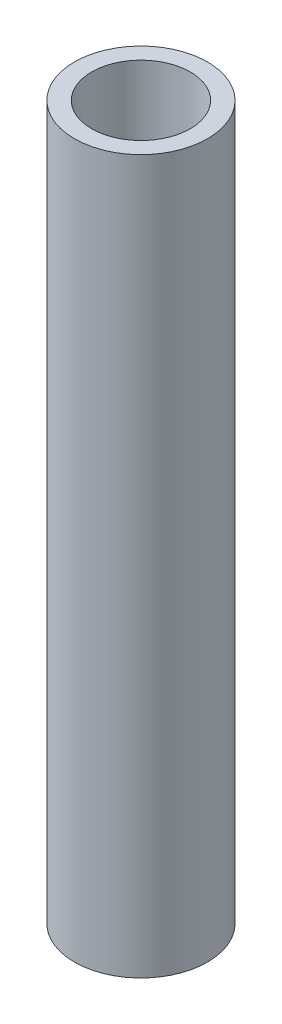
ISO-10303-21;
HEADER;
FILE_DESCRIPTION(('STEP AP214'),'2;1');
FILE_NAME('part.step','',(''),(''),'','','');
FILE_SCHEMA(('AUTOMOTIVE_DESIGN { 1 0 10303 214 1 1 1 1 }'));
ENDSEC;
DATA;
#1=APPLICATION_CONTEXT('core data for automotive mechanical design processes');
#2=APPLICATION_PROTOCOL_DEFINITION('international standard','automotive_design',2000,#1);
#3=PRODUCT_CONTEXT('',#1,'mechanical');
#4=PRODUCT('Part','Part','',(#3));
#5=PRODUCT_RELATED_PRODUCT_CATEGORY('part','',(#4));
#6=PRODUCT_DEFINITION_FORMATION('','',#4);
#7=PRODUCT_DEFINITION_CONTEXT('part definition',#1,'design');
#8=PRODUCT_DEFINITION('design','',#6,#7);
#9=PRODUCT_DEFINITION_SHAPE('','',#8);
#10=(LENGTH_UNIT() NAMED_UNIT(*) SI_UNIT(.MILLI.,.METRE.));
#11=(NAMED_UNIT(*) PLANE_ANGLE_UNIT() SI_UNIT($,.RADIAN.));
#12=(NAMED_UNIT(*) SI_UNIT($,.STERADIAN.) SOLID_ANGLE_UNIT());
#13=UNCERTAINTY_MEASURE_WITH_UNIT(LENGTH_MEASURE(1.E-05),#10,'distance_accuracy_value','');
#14=(GEOMETRIC_REPRESENTATION_CONTEXT(3) GLOBAL_UNCERTAINTY_ASSIGNED_CONTEXT((#13)) GLOBAL_UNIT_ASSIGNED_CONTEXT((#10,
#11,#12)) REPRESENTATION_CONTEXT('',''));
#15=CARTESIAN_POINT('',(0.,0.,0.));
#16=DIRECTION('',(0.,0.,1.));
#17=DIRECTION('',(1.,0.,0.));
#18=AXIS2_PLACEMENT_3D('',#15,#16,#17);
#19=CARTESIAN_POINT('',(0.,114.3,0.));
#20=DIRECTION('',(0.,1.,0.));
#21=DIRECTION('',(0.,0.,1.));
#22=AXIS2_PLACEMENT_3D('',#19,#20,#21);
#23=PLANE('',#22);
#24=CARTESIAN_POINT('',(0.,114.3,0.));
#25=DIRECTION('',(0.,1.,0.));
#26=DIRECTION('',(0.,0.,1.));
#27=AXIS2_PLACEMENT_3D('',#24,#25,#26);
#28=CIRCLE('',#27,10.668);
#29=CARTESIAN_POINT('',(0.,114.3,10.668));
#30=VERTEX_POINT('',#29);
#31=EDGE_CURVE('E10',#30,#30,#28,.T.);
#32=ORIENTED_EDGE('',*,*,#31,.T.);
#33=EDGE_LOOP('',(#32));
#34=FACE_BOUND('',#33,.T.);
#35=CARTESIAN_POINT('',(0.,114.3,0.));
#36=DIRECTION('',(0.,1.,0.));
#37=DIRECTION('',(0.,0.,1.));
#38=AXIS2_PLACEMENT_3D('',#35,#36,#37);
#39=CIRCLE('',#38,7.8994);
#40=CARTESIAN_POINT('',(0.,114.3,7.8994));
#41=VERTEX_POINT('',#40);
#42=EDGE_CURVE('E43',#41,#41,#39,.T.);
#43=ORIENTED_EDGE('',*,*,#42,.F.);
#44=EDGE_LOOP('',(#43));
#45=FACE_BOUND('',#44,.T.);
#46=ADVANCED_FACE('F32',(#34,#45),#23,.T.);
#47=CARTESIAN_POINT('',(0.,0.,0.));
#48=DIRECTION('',(0.,1.,0.));
#49=DIRECTION('',(0.,0.,1.));
#50=AXIS2_PLACEMENT_3D('',#47,#48,#49);
#51=PLANE('',#50);
#52=CARTESIAN_POINT('',(0.,0.,0.));
#53=DIRECTION('',(0.,1.,0.));
#54=DIRECTION('',(0.,0.,1.));
#55=AXIS2_PLACEMENT_3D('',#52,#53,#54);
#56=CIRCLE('',#55,10.668);
#57=CARTESIAN_POINT('',(0.,0.,10.668));
#58=VERTEX_POINT('',#57);
#59=EDGE_CURVE('E36',#58,#58,#56,.T.);
#60=ORIENTED_EDGE('',*,*,#59,.F.);
#61=EDGE_LOOP('',(#60));
#62=FACE_BOUND('',#61,.T.);
#63=CARTESIAN_POINT('',(0.,0.,0.));
#64=DIRECTION('',(0.,1.,0.));
#65=DIRECTION('',(0.,0.,1.));
#66=AXIS2_PLACEMENT_3D('',#63,#64,#65);
#67=CIRCLE('',#66,7.8994);
#68=CARTESIAN_POINT('',(0.,0.,7.8994));
#69=VERTEX_POINT('',#68);
#70=EDGE_CURVE('E45',#69,#69,#67,.T.);
#71=ORIENTED_EDGE('',*,*,#70,.T.);
#72=EDGE_LOOP('',(#71));
#73=FACE_BOUND('',#72,.T.);
#74=ADVANCED_FACE('F55',(#62,#73),#51,.F.);
#75=CARTESIAN_POINT('',(0.,114.3,0.));
#76=DIRECTION('',(0.,-1.,0.));
#77=DIRECTION('',(0.,0.,-1.));
#78=AXIS2_PLACEMENT_3D('',#75,#76,#77);
#79=CYLINDRICAL_SURFACE('',#78,10.668);
#80=ORIENTED_EDGE('',*,*,#31,.F.);
#81=EDGE_LOOP('',(#80));
#82=FACE_BOUND('',#81,.T.);
#83=ORIENTED_EDGE('',*,*,#59,.T.);
#84=EDGE_LOOP('',(#83));
#85=FACE_BOUND('',#84,.T.);
#86=ADVANCED_FACE('F34',(#82,#85),#79,.T.);
#87=CARTESIAN_POINT('',(0.,114.3,0.));
#88=DIRECTION('',(0.,-1.,0.));
#89=DIRECTION('',(0.,0.,-1.));
#90=AXIS2_PLACEMENT_3D('',#87,#88,#89);
#91=CYLINDRICAL_SURFACE('',#90,7.8994);
#92=ORIENTED_EDGE('',*,*,#42,.T.);
#93=EDGE_LOOP('',(#92));
#94=FACE_BOUND('',#93,.T.);
#95=ORIENTED_EDGE('',*,*,#70,.F.);
#96=EDGE_LOOP('',(#95));
#97=FACE_BOUND('',#96,.T.);
#98=ADVANCED_FACE('F51',(#94,#97),#91,.F.);
#99=CLOSED_SHELL('',(#46,#74,#86,#98));
#100=MANIFOLD_SOLID_BREP('B2',#99);
#101=ADVANCED_BREP_SHAPE_REPRESENTATION('',(#18,#100),#14);
#102=SHAPE_DEFINITION_REPRESENTATION(#9,#101);
ENDSEC;
END-ISO-10303-21;
